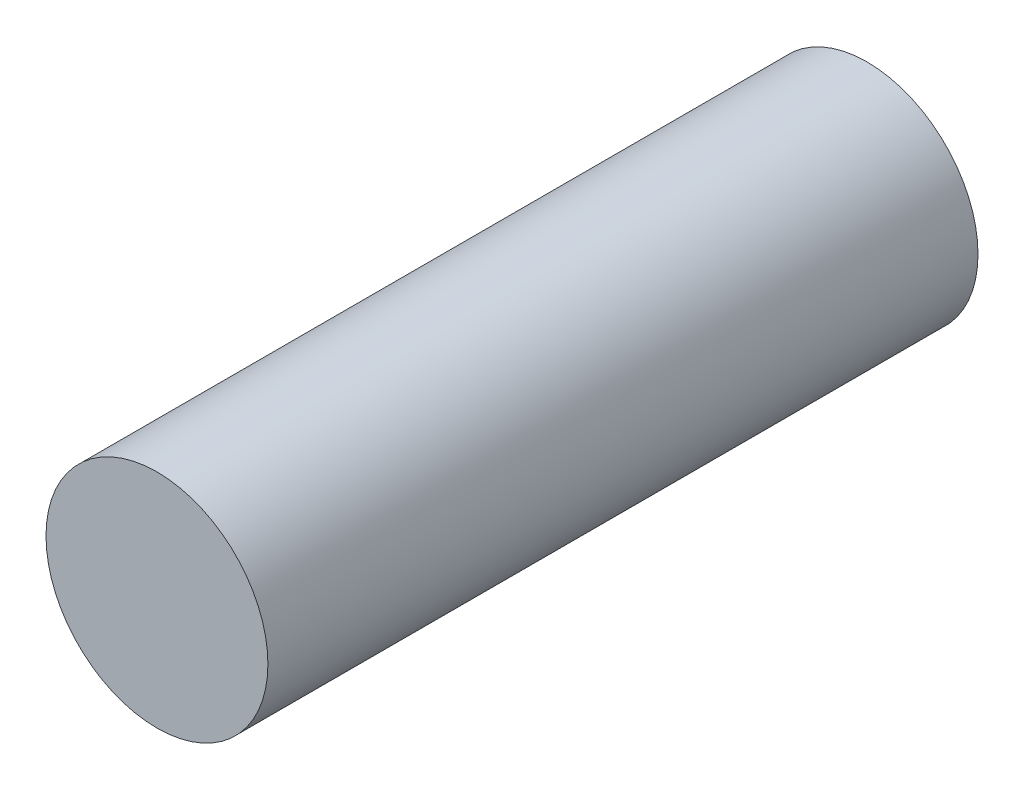
ISO-10303-21;
HEADER;
FILE_DESCRIPTION(('STEP AP214'),'2;1');
FILE_NAME('part.step','',(''),(''),'','','');
FILE_SCHEMA(('AUTOMOTIVE_DESIGN { 1 0 10303 214 1 1 1 1 }'));
ENDSEC;
DATA;
#1=APPLICATION_CONTEXT('core data for automotive mechanical design processes');
#2=APPLICATION_PROTOCOL_DEFINITION('international standard','automotive_design',2000,#1);
#3=PRODUCT_CONTEXT('',#1,'mechanical');
#4=PRODUCT('Part','Part','',(#3));
#5=PRODUCT_RELATED_PRODUCT_CATEGORY('part','',(#4));
#6=PRODUCT_DEFINITION_FORMATION('','',#4);
#7=PRODUCT_DEFINITION_CONTEXT('part definition',#1,'design');
#8=PRODUCT_DEFINITION('design','',#6,#7);
#9=PRODUCT_DEFINITION_SHAPE('','',#8);
#10=(LENGTH_UNIT() NAMED_UNIT(*) SI_UNIT(.MILLI.,.METRE.));
#11=(NAMED_UNIT(*) PLANE_ANGLE_UNIT() SI_UNIT($,.RADIAN.));
#12=(NAMED_UNIT(*) SI_UNIT($,.STERADIAN.) SOLID_ANGLE_UNIT());
#13=UNCERTAINTY_MEASURE_WITH_UNIT(LENGTH_MEASURE(1.E-05),#10,'distance_accuracy_value','');
#14=(GEOMETRIC_REPRESENTATION_CONTEXT(3) GLOBAL_UNCERTAINTY_ASSIGNED_CONTEXT((#13)) GLOBAL_UNIT_ASSIGNED_CONTEXT((#10,
#11,#12)) REPRESENTATION_CONTEXT('',''));
#15=CARTESIAN_POINT('',(0.,0.,0.));
#16=DIRECTION('',(0.,0.,1.));
#17=DIRECTION('',(1.,0.,0.));
#18=AXIS2_PLACEMENT_3D('',#15,#16,#17);
#19=CARTESIAN_POINT('',(0.,0.,8.));
#20=DIRECTION('',(0.,0.,-1.));
#21=DIRECTION('',(-1.,0.,0.));
#22=AXIS2_PLACEMENT_3D('',#19,#20,#21);
#23=CYLINDRICAL_SURFACE('',#22,2.5);
#24=CARTESIAN_POINT('',(0.,0.,8.));
#25=DIRECTION('',(0.,0.,1.));
#26=DIRECTION('',(1.,0.,0.));
#27=AXIS2_PLACEMENT_3D('',#24,#25,#26);
#28=CIRCLE('',#27,2.5);
#29=CARTESIAN_POINT('',(2.5,0.,8.));
#30=VERTEX_POINT('',#29);
#31=EDGE_CURVE('E10',#30,#30,#28,.T.);
#32=ORIENTED_EDGE('',*,*,#31,.F.);
#33=EDGE_LOOP('',(#32));
#34=FACE_BOUND('',#33,.T.);
#35=CARTESIAN_POINT('',(0.,0.,-8.));
#36=DIRECTION('',(0.,0.,1.));
#37=DIRECTION('',(1.,0.,0.));
#38=AXIS2_PLACEMENT_3D('',#35,#36,#37);
#39=CIRCLE('',#38,2.5);
#40=CARTESIAN_POINT('',(2.5,0.,-8.));
#41=VERTEX_POINT('',#40);
#42=EDGE_CURVE('E36',#41,#41,#39,.T.);
#43=ORIENTED_EDGE('',*,*,#42,.T.);
#44=EDGE_LOOP('',(#43));
#45=FACE_BOUND('',#44,.T.);
#46=ADVANCED_FACE('F33',(#34,#45),#23,.T.);
#47=CARTESIAN_POINT('',(0.,0.,8.));
#48=DIRECTION('',(0.,0.,1.));
#49=DIRECTION('',(1.,0.,0.));
#50=AXIS2_PLACEMENT_3D('',#47,#48,#49);
#51=PLANE('',#50);
#52=ORIENTED_EDGE('',*,*,#31,.T.);
#53=EDGE_LOOP('',(#52));
#54=FACE_BOUND('',#53,.T.);
#55=ADVANCED_FACE('F48',(#54),#51,.T.);
#56=CARTESIAN_POINT('',(0.,0.,-8.));
#57=DIRECTION('',(0.,0.,1.));
#58=DIRECTION('',(1.,0.,0.));
#59=AXIS2_PLACEMENT_3D('',#56,#57,#58);
#60=PLANE('',#59);
#61=ORIENTED_EDGE('',*,*,#42,.F.);
#62=EDGE_LOOP('',(#61));
#63=FACE_BOUND('',#62,.T.);
#64=ADVANCED_FACE('F46',(#63),#60,.F.);
#65=CLOSED_SHELL('',(#46,#55,#64));
#66=MANIFOLD_SOLID_BREP('B2',#65);
#67=ADVANCED_BREP_SHAPE_REPRESENTATION('',(#18,#66),#14);
#68=SHAPE_DEFINITION_REPRESENTATION(#9,#67);
ENDSEC;
END-ISO-10303-21;
